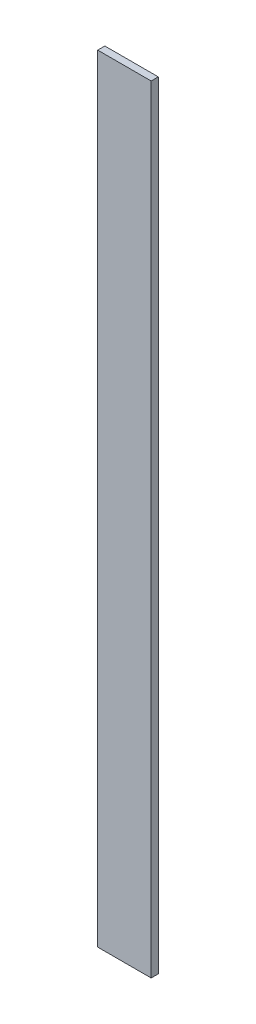
ISO-10303-21;
HEADER;
FILE_DESCRIPTION(('STEP AP214'),'2;1');
FILE_NAME('part.step','',(''),(''),'','','');
FILE_SCHEMA(('AUTOMOTIVE_DESIGN { 1 0 10303 214 1 1 1 1 }'));
ENDSEC;
DATA;
#1=APPLICATION_CONTEXT('core data for automotive mechanical design processes');
#2=APPLICATION_PROTOCOL_DEFINITION('international standard','automotive_design',2000,#1);
#3=PRODUCT_CONTEXT('',#1,'mechanical');
#4=PRODUCT('Part','Part','',(#3));
#5=PRODUCT_RELATED_PRODUCT_CATEGORY('part','',(#4));
#6=PRODUCT_DEFINITION_FORMATION('','',#4);
#7=PRODUCT_DEFINITION_CONTEXT('part definition',#1,'design');
#8=PRODUCT_DEFINITION('design','',#6,#7);
#9=PRODUCT_DEFINITION_SHAPE('','',#8);
#10=(LENGTH_UNIT() NAMED_UNIT(*) SI_UNIT(.MILLI.,.METRE.));
#11=(NAMED_UNIT(*) PLANE_ANGLE_UNIT() SI_UNIT($,.RADIAN.));
#12=(NAMED_UNIT(*) SI_UNIT($,.STERADIAN.) SOLID_ANGLE_UNIT());
#13=UNCERTAINTY_MEASURE_WITH_UNIT(LENGTH_MEASURE(1.E-05),#10,'distance_accuracy_value','');
#14=(GEOMETRIC_REPRESENTATION_CONTEXT(3) GLOBAL_UNCERTAINTY_ASSIGNED_CONTEXT((#13)) GLOBAL_UNIT_ASSIGNED_CONTEXT((#10,
#11,#12)) REPRESENTATION_CONTEXT('',''));
#15=CARTESIAN_POINT('',(0.,0.,0.));
#16=DIRECTION('',(0.,0.,1.));
#17=DIRECTION('',(1.,0.,0.));
#18=AXIS2_PLACEMENT_3D('',#15,#16,#17);
#19=CARTESIAN_POINT('',(7.5,-109.,2.));
#20=DIRECTION('',(-1.,0.,0.));
#21=DIRECTION('',(0.,0.,1.));
#22=AXIS2_PLACEMENT_3D('',#19,#20,#21);
#23=PLANE('',#22);
#24=DIRECTION('',(0.,1.,0.));
#25=VECTOR('',#24,1.);
#26=CARTESIAN_POINT('',(7.5,-109.,0.));
#27=LINE('',#26,#25);
#28=CARTESIAN_POINT('',(7.5,-109.,0.));
#29=VERTEX_POINT('',#28);
#30=CARTESIAN_POINT('',(7.5,109.,0.));
#31=VERTEX_POINT('',#30);
#32=EDGE_CURVE('E107',#29,#31,#27,.T.);
#33=ORIENTED_EDGE('',*,*,#32,.T.);
#34=DIRECTION('',(0.,0.,-1.));
#35=VECTOR('',#34,1.);
#36=CARTESIAN_POINT('',(7.5,109.,2.));
#37=LINE('',#36,#35);
#38=CARTESIAN_POINT('',(7.5,109.,2.));
#39=VERTEX_POINT('',#38);
#40=EDGE_CURVE('E11',#39,#31,#37,.T.);
#41=ORIENTED_EDGE('',*,*,#40,.F.);
#42=DIRECTION('',(0.,1.,0.));
#43=VECTOR('',#42,1.);
#44=CARTESIAN_POINT('',(7.5,-109.,2.));
#45=LINE('',#44,#43);
#46=CARTESIAN_POINT('',(7.5,-109.,2.));
#47=VERTEX_POINT('',#46);
#48=EDGE_CURVE('E91',#47,#39,#45,.T.);
#49=ORIENTED_EDGE('',*,*,#48,.F.);
#50=DIRECTION('',(0.,0.,-1.));
#51=VECTOR('',#50,1.);
#52=CARTESIAN_POINT('',(7.5,-109.,2.));
#53=LINE('',#52,#51);
#54=EDGE_CURVE('E103',#47,#29,#53,.T.);
#55=ORIENTED_EDGE('',*,*,#54,.T.);
#56=EDGE_LOOP('',(#33,#41,#49,#55));
#57=FACE_BOUND('',#56,.T.);
#58=ADVANCED_FACE('F39',(#57),#23,.F.);
#59=CARTESIAN_POINT('',(-7.5,109.,2.));
#60=DIRECTION('',(0.,-1.,0.));
#61=DIRECTION('',(0.,0.,-1.));
#62=AXIS2_PLACEMENT_3D('',#59,#60,#61);
#63=PLANE('',#62);
#64=DIRECTION('',(-1.,0.,0.));
#65=VECTOR('',#64,1.);
#66=CARTESIAN_POINT('',(-7.5,109.,0.));
#67=LINE('',#66,#65);
#68=CARTESIAN_POINT('',(-7.5,109.,0.));
#69=VERTEX_POINT('',#68);
#70=EDGE_CURVE('E96',#31,#69,#67,.T.);
#71=ORIENTED_EDGE('',*,*,#70,.T.);
#72=DIRECTION('',(0.,0.,-1.));
#73=VECTOR('',#72,1.);
#74=CARTESIAN_POINT('',(-7.5,109.,2.));
#75=LINE('',#74,#73);
#76=CARTESIAN_POINT('',(-7.5,109.,2.));
#77=VERTEX_POINT('',#76);
#78=EDGE_CURVE('E48',#77,#69,#75,.T.);
#79=ORIENTED_EDGE('',*,*,#78,.F.);
#80=DIRECTION('',(-1.,0.,0.));
#81=VECTOR('',#80,1.);
#82=CARTESIAN_POINT('',(-7.5,109.,2.));
#83=LINE('',#82,#81);
#84=EDGE_CURVE('E86',#39,#77,#83,.T.);
#85=ORIENTED_EDGE('',*,*,#84,.F.);
#86=ORIENTED_EDGE('',*,*,#40,.T.);
#87=EDGE_LOOP('',(#71,#79,#85,#86));
#88=FACE_BOUND('',#87,.T.);
#89=ADVANCED_FACE('F95',(#88),#63,.F.);
#90=CARTESIAN_POINT('',(-7.5,-109.,2.));
#91=DIRECTION('',(1.,0.,0.));
#92=DIRECTION('',(0.,0.,-1.));
#93=AXIS2_PLACEMENT_3D('',#90,#91,#92);
#94=PLANE('',#93);
#95=DIRECTION('',(0.,-1.,0.));
#96=VECTOR('',#95,1.);
#97=CARTESIAN_POINT('',(-7.5,-109.,0.));
#98=LINE('',#97,#96);
#99=CARTESIAN_POINT('',(-7.5,-109.,0.));
#100=VERTEX_POINT('',#99);
#101=EDGE_CURVE('E73',#69,#100,#98,.T.);
#102=ORIENTED_EDGE('',*,*,#101,.T.);
#103=DIRECTION('',(0.,0.,-1.));
#104=VECTOR('',#103,1.);
#105=CARTESIAN_POINT('',(-7.5,-109.,2.));
#106=LINE('',#105,#104);
#107=CARTESIAN_POINT('',(-7.5,-109.,2.));
#108=VERTEX_POINT('',#107);
#109=EDGE_CURVE('E98',#108,#100,#106,.T.);
#110=ORIENTED_EDGE('',*,*,#109,.F.);
#111=DIRECTION('',(0.,-1.,0.));
#112=VECTOR('',#111,1.);
#113=CARTESIAN_POINT('',(-7.5,-109.,2.));
#114=LINE('',#113,#112);
#115=EDGE_CURVE('E89',#77,#108,#114,.T.);
#116=ORIENTED_EDGE('',*,*,#115,.F.);
#117=ORIENTED_EDGE('',*,*,#78,.T.);
#118=EDGE_LOOP('',(#102,#110,#116,#117));
#119=FACE_BOUND('',#118,.T.);
#120=ADVANCED_FACE('F99',(#119),#94,.F.);
#121=CARTESIAN_POINT('',(-7.5,-109.,2.));
#122=DIRECTION('',(0.,1.,0.));
#123=DIRECTION('',(0.,0.,1.));
#124=AXIS2_PLACEMENT_3D('',#121,#122,#123);
#125=PLANE('',#124);
#126=DIRECTION('',(1.,0.,0.));
#127=VECTOR('',#126,1.);
#128=CARTESIAN_POINT('',(-7.5,-109.,0.));
#129=LINE('',#128,#127);
#130=EDGE_CURVE('E79',#100,#29,#129,.T.);
#131=ORIENTED_EDGE('',*,*,#130,.T.);
#132=ORIENTED_EDGE('',*,*,#54,.F.);
#133=DIRECTION('',(1.,0.,0.));
#134=VECTOR('',#133,1.);
#135=CARTESIAN_POINT('',(-7.5,-109.,2.));
#136=LINE('',#135,#134);
#137=EDGE_CURVE('E56',#108,#47,#136,.T.);
#138=ORIENTED_EDGE('',*,*,#137,.F.);
#139=ORIENTED_EDGE('',*,*,#109,.T.);
#140=EDGE_LOOP('',(#131,#132,#138,#139));
#141=FACE_BOUND('',#140,.T.);
#142=ADVANCED_FACE('F120',(#141),#125,.F.);
#143=CARTESIAN_POINT('',(0.,0.,2.));
#144=DIRECTION('',(0.,0.,-1.));
#145=DIRECTION('',(-1.,0.,0.));
#146=AXIS2_PLACEMENT_3D('',#143,#144,#145);
#147=PLANE('',#146);
#148=ORIENTED_EDGE('',*,*,#48,.T.);
#149=ORIENTED_EDGE('',*,*,#84,.T.);
#150=ORIENTED_EDGE('',*,*,#115,.T.);
#151=ORIENTED_EDGE('',*,*,#137,.T.);
#152=EDGE_LOOP('',(#148,#149,#150,#151));
#153=FACE_BOUND('',#152,.T.);
#154=ADVANCED_FACE('F87',(#153),#147,.F.);
#155=CARTESIAN_POINT('',(0.,0.,0.));
#156=DIRECTION('',(0.,0.,-1.));
#157=DIRECTION('',(-1.,0.,0.));
#158=AXIS2_PLACEMENT_3D('',#155,#156,#157);
#159=PLANE('',#158);
#160=ORIENTED_EDGE('',*,*,#32,.F.);
#161=ORIENTED_EDGE('',*,*,#130,.F.);
#162=ORIENTED_EDGE('',*,*,#101,.F.);
#163=ORIENTED_EDGE('',*,*,#70,.F.);
#164=EDGE_LOOP('',(#160,#161,#162,#163));
#165=FACE_BOUND('',#164,.T.);
#166=ADVANCED_FACE('F123',(#165),#159,.T.);
#167=CLOSED_SHELL('',(#58,#89,#120,#142,#154,#166));
#168=MANIFOLD_SOLID_BREP('B2',#167);
#169=ADVANCED_BREP_SHAPE_REPRESENTATION('',(#18,#168),#14);
#170=SHAPE_DEFINITION_REPRESENTATION(#9,#169);
ENDSEC;
END-ISO-10303-21;
